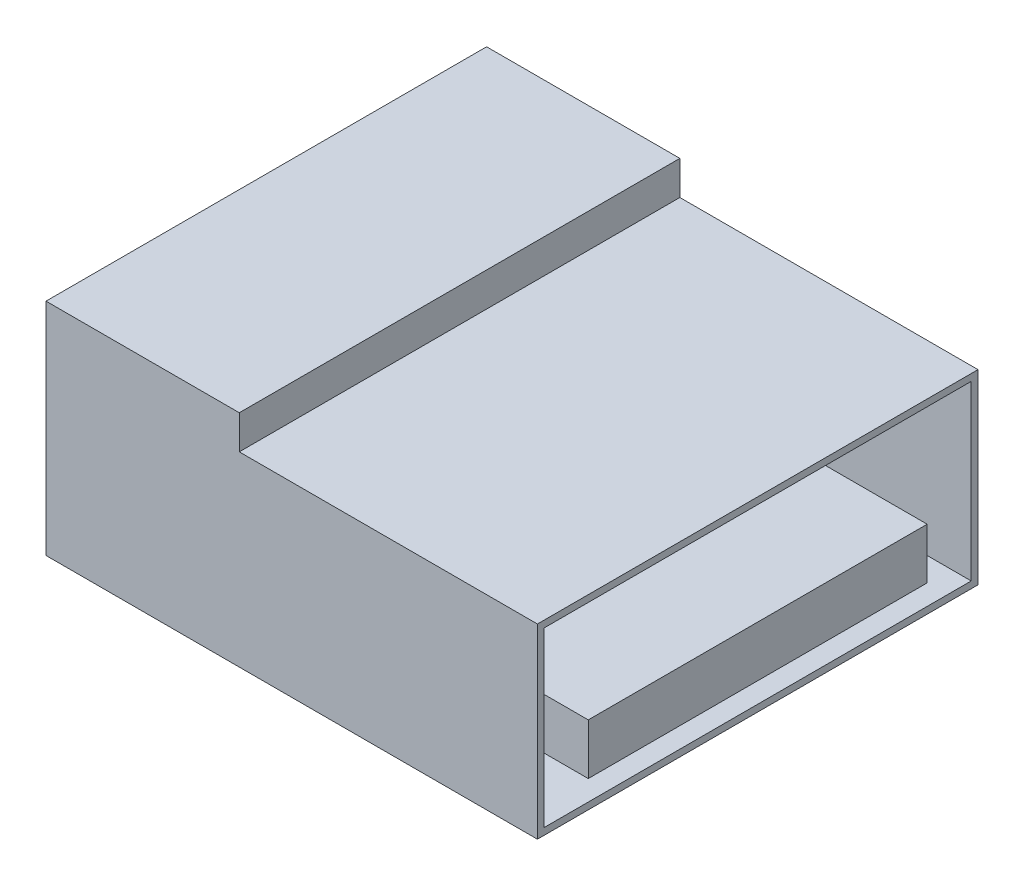
ISO-10303-21;
HEADER;
FILE_DESCRIPTION(('STEP AP214'),'2;1');
FILE_NAME('part.step','',(''),(''),'','','');
FILE_SCHEMA(('AUTOMOTIVE_DESIGN { 1 0 10303 214 1 1 1 1 }'));
ENDSEC;
DATA;
#1=APPLICATION_CONTEXT('core data for automotive mechanical design processes');
#2=APPLICATION_PROTOCOL_DEFINITION('international standard','automotive_design',2000,#1);
#3=PRODUCT_CONTEXT('',#1,'mechanical');
#4=PRODUCT('Part','Part','',(#3));
#5=PRODUCT_RELATED_PRODUCT_CATEGORY('part','',(#4));
#6=PRODUCT_DEFINITION_FORMATION('','',#4);
#7=PRODUCT_DEFINITION_CONTEXT('part definition',#1,'design');
#8=PRODUCT_DEFINITION('design','',#6,#7);
#9=PRODUCT_DEFINITION_SHAPE('','',#8);
#10=(LENGTH_UNIT() NAMED_UNIT(*) SI_UNIT(.MILLI.,.METRE.));
#11=(NAMED_UNIT(*) PLANE_ANGLE_UNIT() SI_UNIT($,.RADIAN.));
#12=(NAMED_UNIT(*) SI_UNIT($,.STERADIAN.) SOLID_ANGLE_UNIT());
#13=UNCERTAINTY_MEASURE_WITH_UNIT(LENGTH_MEASURE(1.E-05),#10,'distance_accuracy_value','');
#14=(GEOMETRIC_REPRESENTATION_CONTEXT(3) GLOBAL_UNCERTAINTY_ASSIGNED_CONTEXT((#13)) GLOBAL_UNIT_ASSIGNED_CONTEXT((#10,
#11,#12)) REPRESENTATION_CONTEXT('',''));
#15=CARTESIAN_POINT('',(0.,0.,0.));
#16=DIRECTION('',(0.,0.,1.));
#17=DIRECTION('',(1.,0.,0.));
#18=AXIS2_PLACEMENT_3D('',#15,#16,#17);
#19=CARTESIAN_POINT('',(-3.58118361153263,0.,0.));
#20=DIRECTION('',(1.,0.,0.));
#21=DIRECTION('',(0.,0.,-1.));
#22=AXIS2_PLACEMENT_3D('',#19,#20,#21);
#23=PLANE('',#22);
#24=DIRECTION('',(0.,-1.,0.));
#25=VECTOR('',#24,1.);
#26=CARTESIAN_POINT('',(-3.58118361153262,5.3,8.31138088012141));
#27=LINE('',#26,#25);
#28=CARTESIAN_POINT('',(-3.58118361153262,5.3,8.31138088012141));
#29=VERTEX_POINT('',#28);
#30=CARTESIAN_POINT('',(-3.58118361153262,0.2,8.31138088012141));
#31=VERTEX_POINT('',#30);
#32=EDGE_CURVE('E177',#29,#31,#27,.T.);
#33=ORIENTED_EDGE('',*,*,#32,.T.);
#34=DIRECTION('',(0.,0.,-1.));
#35=VECTOR('',#34,1.);
#36=CARTESIAN_POINT('',(-3.58118361153262,0.2,8.31138088012141));
#37=LINE('',#36,#35);
#38=CARTESIAN_POINT('',(-3.58118361153263,0.2,-4.2886191198786));
#39=VERTEX_POINT('',#38);
#40=EDGE_CURVE('E181',#31,#39,#37,.T.);
#41=ORIENTED_EDGE('',*,*,#40,.T.);
#42=DIRECTION('',(0.,1.,0.));
#43=VECTOR('',#42,1.);
#44=CARTESIAN_POINT('',(-3.58118361153263,5.3,-4.2886191198786));
#45=LINE('',#44,#43);
#46=CARTESIAN_POINT('',(-3.58118361153263,5.3,-4.2886191198786));
#47=VERTEX_POINT('',#46);
#48=EDGE_CURVE('E186',#39,#47,#45,.T.);
#49=ORIENTED_EDGE('',*,*,#48,.T.);
#50=DIRECTION('',(0.,0.,1.));
#51=VECTOR('',#50,1.);
#52=CARTESIAN_POINT('',(-3.58118361153262,5.3,8.31138088012141));
#53=LINE('',#52,#51);
#54=EDGE_CURVE('E190',#47,#29,#53,.T.);
#55=ORIENTED_EDGE('',*,*,#54,.T.);
#56=EDGE_LOOP('',(#33,#41,#49,#55));
#57=FACE_BOUND('',#56,.T.);
#58=DIRECTION('',(0.,0.,-1.));
#59=VECTOR('',#58,1.);
#60=CARTESIAN_POINT('',(-3.58118361153262,0.799999999999999,7.01138088012141));
#61=LINE('',#60,#59);
#62=CARTESIAN_POINT('',(-3.58118361153262,0.799999999999999,7.01138088012141));
#63=VERTEX_POINT('',#62);
#64=CARTESIAN_POINT('',(-3.58118361153263,0.8,-2.98861911987859));
#65=VERTEX_POINT('',#64);
#66=EDGE_CURVE('E474',#63,#65,#61,.T.);
#67=ORIENTED_EDGE('',*,*,#66,.F.);
#68=DIRECTION('',(0.,-1.,0.));
#69=VECTOR('',#68,1.);
#70=CARTESIAN_POINT('',(-3.58118361153262,2.3,7.01138088012141));
#71=LINE('',#70,#69);
#72=CARTESIAN_POINT('',(-3.58118361153262,2.3,7.01138088012141));
#73=VERTEX_POINT('',#72);
#74=EDGE_CURVE('E166',#73,#63,#71,.T.);
#75=ORIENTED_EDGE('',*,*,#74,.F.);
#76=DIRECTION('',(0.,0.,1.));
#77=VECTOR('',#76,1.);
#78=CARTESIAN_POINT('',(-3.58118361153262,2.3,7.01138088012141));
#79=LINE('',#78,#77);
#80=CARTESIAN_POINT('',(-3.58118361153263,2.3,-2.9886191198786));
#81=VERTEX_POINT('',#80);
#82=EDGE_CURVE('E162',#81,#73,#79,.T.);
#83=ORIENTED_EDGE('',*,*,#82,.F.);
#84=DIRECTION('',(0.,1.,0.));
#85=VECTOR('',#84,1.);
#86=CARTESIAN_POINT('',(-3.58118361153263,2.3,-2.98861911987859));
#87=LINE('',#86,#85);
#88=EDGE_CURVE('E470',#65,#81,#87,.T.);
#89=ORIENTED_EDGE('',*,*,#88,.F.);
#90=EDGE_LOOP('',(#67,#75,#83,#89));
#91=FACE_BOUND('',#90,.T.);
#92=ADVANCED_FACE('F39',(#57,#91),#23,.T.);
#93=CARTESIAN_POINT('',(-8.58118361153263,5.5,-4.48861911987859));
#94=DIRECTION('',(1.,0.,0.));
#95=DIRECTION('',(0.,0.,-1.));
#96=AXIS2_PLACEMENT_3D('',#93,#94,#95);
#97=PLANE('',#96);
#98=DIRECTION('',(0.,0.,1.));
#99=VECTOR('',#98,1.);
#100=CARTESIAN_POINT('',(-8.58118361153263,0.,-4.48861911987859));
#101=LINE('',#100,#99);
#102=CARTESIAN_POINT('',(-8.58118361153263,0.,-4.48861911987859));
#103=VERTEX_POINT('',#102);
#104=CARTESIAN_POINT('',(-8.58118361153263,0.,8.51138088012141));
#105=VERTEX_POINT('',#104);
#106=EDGE_CURVE('E242',#103,#105,#101,.T.);
#107=ORIENTED_EDGE('',*,*,#106,.T.);
#108=DIRECTION('',(0.,-1.,0.));
#109=VECTOR('',#108,1.);
#110=CARTESIAN_POINT('',(-8.58118361153263,5.5,8.51138088012141));
#111=LINE('',#110,#109);
#112=CARTESIAN_POINT('',(-8.58118361153263,6.5,8.51138088012141));
#113=VERTEX_POINT('',#112);
#114=EDGE_CURVE('E11',#113,#105,#111,.T.);
#115=ORIENTED_EDGE('',*,*,#114,.F.);
#116=DIRECTION('',(0.,0.,1.));
#117=VECTOR('',#116,1.);
#118=CARTESIAN_POINT('',(-8.58118361153263,6.5,-4.48861911987859));
#119=LINE('',#118,#117);
#120=CARTESIAN_POINT('',(-8.58118361153263,6.5,-4.48861911987859));
#121=VERTEX_POINT('',#120);
#122=EDGE_CURVE('E217',#121,#113,#119,.T.);
#123=ORIENTED_EDGE('',*,*,#122,.F.);
#124=DIRECTION('',(0.,-1.,0.));
#125=VECTOR('',#124,1.);
#126=CARTESIAN_POINT('',(-8.58118361153263,5.5,-4.48861911987859));
#127=LINE('',#126,#125);
#128=EDGE_CURVE('E253',#121,#103,#127,.T.);
#129=ORIENTED_EDGE('',*,*,#128,.T.);
#130=EDGE_LOOP('',(#107,#115,#123,#129));
#131=FACE_BOUND('',#130,.T.);
#132=ADVANCED_FACE('F41',(#131),#97,.F.);
#133=CARTESIAN_POINT('',(-8.58118361153263,5.5,8.51138088012141));
#134=DIRECTION('',(0.,0.,-1.));
#135=DIRECTION('',(-1.,0.,0.));
#136=AXIS2_PLACEMENT_3D('',#133,#134,#135);
#137=PLANE('',#136);
#138=DIRECTION('',(1.,0.,0.));
#139=VECTOR('',#138,1.);
#140=CARTESIAN_POINT('',(-8.58118361153263,0.,8.51138088012141));
#141=LINE('',#140,#139);
#142=CARTESIAN_POINT('',(5.91881638846738,0.,8.51138088012141));
#143=VERTEX_POINT('',#142);
#144=EDGE_CURVE('E257',#105,#143,#141,.T.);
#145=ORIENTED_EDGE('',*,*,#144,.T.);
#146=DIRECTION('',(0.,-1.,0.));
#147=VECTOR('',#146,1.);
#148=CARTESIAN_POINT('',(5.91881638846738,5.5,8.51138088012141));
#149=LINE('',#148,#147);
#150=CARTESIAN_POINT('',(5.91881638846738,5.5,8.51138088012141));
#151=VERTEX_POINT('',#150);
#152=EDGE_CURVE('E48',#151,#143,#149,.T.);
#153=ORIENTED_EDGE('',*,*,#152,.F.);
#154=DIRECTION('',(1.,0.,0.));
#155=VECTOR('',#154,1.);
#156=CARTESIAN_POINT('',(-8.58118361153263,5.5,8.51138088012141));
#157=LINE('',#156,#155);
#158=CARTESIAN_POINT('',(-2.87803542554563,5.5,8.51138088012141));
#159=VERTEX_POINT('',#158);
#160=EDGE_CURVE('E243',#159,#151,#157,.T.);
#161=ORIENTED_EDGE('',*,*,#160,.F.);
#162=DIRECTION('',(0.,-1.,0.));
#163=VECTOR('',#162,1.);
#164=CARTESIAN_POINT('',(-2.87803542554563,6.5,8.51138088012141));
#165=LINE('',#164,#163);
#166=CARTESIAN_POINT('',(-2.87803542554563,6.5,8.51138088012141));
#167=VERTEX_POINT('',#166);
#168=EDGE_CURVE('E238',#167,#159,#165,.T.);
#169=ORIENTED_EDGE('',*,*,#168,.F.);
#170=DIRECTION('',(1.,0.,0.));
#171=VECTOR('',#170,1.);
#172=CARTESIAN_POINT('',(-8.58118361153263,6.5,8.51138088012141));
#173=LINE('',#172,#171);
#174=EDGE_CURVE('E221',#113,#167,#173,.T.);
#175=ORIENTED_EDGE('',*,*,#174,.F.);
#176=ORIENTED_EDGE('',*,*,#114,.T.);
#177=EDGE_LOOP('',(#145,#153,#161,#169,#175,#176));
#178=FACE_BOUND('',#177,.T.);
#179=ADVANCED_FACE('F301',(#178),#137,.F.);
#180=CARTESIAN_POINT('',(5.91881638846737,5.5,-4.48861911987859));
#181=DIRECTION('',(-1.,0.,0.));
#182=DIRECTION('',(0.,0.,1.));
#183=AXIS2_PLACEMENT_3D('',#180,#181,#182);
#184=PLANE('',#183);
#185=DIRECTION('',(0.,0.,-1.));
#186=VECTOR('',#185,1.);
#187=CARTESIAN_POINT('',(5.91881638846738,0.2,8.3113808801214));
#188=LINE('',#187,#186);
#189=CARTESIAN_POINT('',(5.91881638846738,0.2,8.31138088012141));
#190=VERTEX_POINT('',#189);
#191=CARTESIAN_POINT('',(5.91881638846737,0.2,-4.2886191198786));
#192=VERTEX_POINT('',#191);
#193=EDGE_CURVE('E172',#190,#192,#188,.T.);
#194=ORIENTED_EDGE('',*,*,#193,.F.);
#195=DIRECTION('',(0.,-1.,0.));
#196=VECTOR('',#195,1.);
#197=CARTESIAN_POINT('',(5.91881638846738,5.3,8.3113808801214));
#198=LINE('',#197,#196);
#199=CARTESIAN_POINT('',(5.91881638846738,5.3,8.3113808801214));
#200=VERTEX_POINT('',#199);
#201=EDGE_CURVE('E63',#200,#190,#198,.T.);
#202=ORIENTED_EDGE('',*,*,#201,.F.);
#203=DIRECTION('',(0.,0.,1.));
#204=VECTOR('',#203,1.);
#205=CARTESIAN_POINT('',(5.91881638846738,5.3,8.3113808801214));
#206=LINE('',#205,#204);
#207=CARTESIAN_POINT('',(5.91881638846737,5.3,-4.2886191198786));
#208=VERTEX_POINT('',#207);
#209=EDGE_CURVE('E182',#208,#200,#206,.T.);
#210=ORIENTED_EDGE('',*,*,#209,.F.);
#211=DIRECTION('',(0.,1.,0.));
#212=VECTOR('',#211,1.);
#213=CARTESIAN_POINT('',(5.91881638846737,5.3,-4.2886191198786));
#214=LINE('',#213,#212);
#215=EDGE_CURVE('E198',#192,#208,#214,.T.);
#216=ORIENTED_EDGE('',*,*,#215,.F.);
#217=EDGE_LOOP('',(#194,#202,#210,#216));
#218=FACE_BOUND('',#217,.T.);
#219=DIRECTION('',(0.,0.,-1.));
#220=VECTOR('',#219,1.);
#221=CARTESIAN_POINT('',(5.91881638846737,0.,-4.48861911987859));
#222=LINE('',#221,#220);
#223=CARTESIAN_POINT('',(5.91881638846737,0.,-4.48861911987859));
#224=VERTEX_POINT('',#223);
#225=EDGE_CURVE('E260',#143,#224,#222,.T.);
#226=ORIENTED_EDGE('',*,*,#225,.T.);
#227=DIRECTION('',(0.,-1.,0.));
#228=VECTOR('',#227,1.);
#229=CARTESIAN_POINT('',(5.91881638846737,5.5,-4.48861911987859));
#230=LINE('',#229,#228);
#231=CARTESIAN_POINT('',(5.91881638846737,5.5,-4.48861911987859));
#232=VERTEX_POINT('',#231);
#233=EDGE_CURVE('E268',#232,#224,#230,.T.);
#234=ORIENTED_EDGE('',*,*,#233,.F.);
#235=DIRECTION('',(0.,0.,-1.));
#236=VECTOR('',#235,1.);
#237=CARTESIAN_POINT('',(5.91881638846737,5.5,-4.48861911987859));
#238=LINE('',#237,#236);
#239=EDGE_CURVE('E246',#151,#232,#238,.T.);
#240=ORIENTED_EDGE('',*,*,#239,.F.);
#241=ORIENTED_EDGE('',*,*,#152,.T.);
#242=EDGE_LOOP('',(#226,#234,#240,#241));
#243=FACE_BOUND('',#242,.T.);
#244=ADVANCED_FACE('F277',(#218,#243),#184,.F.);
#245=CARTESIAN_POINT('',(-8.58118361153263,5.5,-4.48861911987859));
#246=DIRECTION('',(0.,0.,1.));
#247=DIRECTION('',(1.,0.,0.));
#248=AXIS2_PLACEMENT_3D('',#245,#246,#247);
#249=PLANE('',#248);
#250=DIRECTION('',(-1.,0.,0.));
#251=VECTOR('',#250,1.);
#252=CARTESIAN_POINT('',(-8.58118361153263,0.,-4.48861911987859));
#253=LINE('',#252,#251);
#254=EDGE_CURVE('E247',#224,#103,#253,.T.);
#255=ORIENTED_EDGE('',*,*,#254,.T.);
#256=ORIENTED_EDGE('',*,*,#128,.F.);
#257=DIRECTION('',(-1.,0.,0.));
#258=VECTOR('',#257,1.);
#259=CARTESIAN_POINT('',(-8.58118361153263,6.5,-4.48861911987859));
#260=LINE('',#259,#258);
#261=CARTESIAN_POINT('',(-2.87803542554563,6.5,-4.48861911987859));
#262=VERTEX_POINT('',#261);
#263=EDGE_CURVE('E227',#262,#121,#260,.T.);
#264=ORIENTED_EDGE('',*,*,#263,.F.);
#265=DIRECTION('',(0.,-1.,0.));
#266=VECTOR('',#265,1.);
#267=CARTESIAN_POINT('',(-2.87803542554563,6.5,-4.48861911987859));
#268=LINE('',#267,#266);
#269=CARTESIAN_POINT('',(-2.87803542554563,5.5,-4.48861911987859));
#270=VERTEX_POINT('',#269);
#271=EDGE_CURVE('E231',#262,#270,#268,.T.);
#272=ORIENTED_EDGE('',*,*,#271,.T.);
#273=DIRECTION('',(-1.,0.,0.));
#274=VECTOR('',#273,1.);
#275=CARTESIAN_POINT('',(-8.58118361153263,5.5,-4.48861911987859));
#276=LINE('',#275,#274);
#277=EDGE_CURVE('E250',#232,#270,#276,.T.);
#278=ORIENTED_EDGE('',*,*,#277,.F.);
#279=ORIENTED_EDGE('',*,*,#233,.T.);
#280=EDGE_LOOP('',(#255,#256,#264,#272,#278,#279));
#281=FACE_BOUND('',#280,.T.);
#282=ADVANCED_FACE('F286',(#281),#249,.F.);
#283=CARTESIAN_POINT('',(0.,5.5,0.));
#284=DIRECTION('',(0.,1.,0.));
#285=DIRECTION('',(0.,0.,1.));
#286=AXIS2_PLACEMENT_3D('',#283,#284,#285);
#287=PLANE('',#286);
#288=DIRECTION('',(0.,0.,-1.));
#289=VECTOR('',#288,1.);
#290=CARTESIAN_POINT('',(-2.87803542554563,5.5,-4.48861911987859));
#291=LINE('',#290,#289);
#292=EDGE_CURVE('E208',#159,#270,#291,.T.);
#293=ORIENTED_EDGE('',*,*,#292,.F.);
#294=ORIENTED_EDGE('',*,*,#160,.T.);
#295=ORIENTED_EDGE('',*,*,#239,.T.);
#296=ORIENTED_EDGE('',*,*,#277,.T.);
#297=EDGE_LOOP('',(#293,#294,#295,#296));
#298=FACE_BOUND('',#297,.T.);
#299=ADVANCED_FACE('F300',(#298),#287,.T.);
#300=CARTESIAN_POINT('',(0.,0.,0.));
#301=DIRECTION('',(0.,1.,0.));
#302=DIRECTION('',(0.,0.,1.));
#303=AXIS2_PLACEMENT_3D('',#300,#301,#302);
#304=PLANE('',#303);
#305=ORIENTED_EDGE('',*,*,#106,.F.);
#306=ORIENTED_EDGE('',*,*,#254,.F.);
#307=ORIENTED_EDGE('',*,*,#225,.F.);
#308=ORIENTED_EDGE('',*,*,#144,.F.);
#309=EDGE_LOOP('',(#305,#306,#307,#308));
#310=FACE_BOUND('',#309,.T.);
#311=ADVANCED_FACE('F284',(#310),#304,.F.);
#312=CARTESIAN_POINT('',(-2.87803542554563,6.5,-4.48861911987859));
#313=DIRECTION('',(-1.,0.,0.));
#314=DIRECTION('',(0.,0.,1.));
#315=AXIS2_PLACEMENT_3D('',#312,#313,#314);
#316=PLANE('',#315);
#317=ORIENTED_EDGE('',*,*,#292,.T.);
#318=ORIENTED_EDGE('',*,*,#271,.F.);
#319=DIRECTION('',(0.,0.,-1.));
#320=VECTOR('',#319,1.);
#321=CARTESIAN_POINT('',(-2.87803542554563,6.5,-4.48861911987859));
#322=LINE('',#321,#320);
#323=EDGE_CURVE('E224',#167,#262,#322,.T.);
#324=ORIENTED_EDGE('',*,*,#323,.F.);
#325=ORIENTED_EDGE('',*,*,#168,.T.);
#326=EDGE_LOOP('',(#317,#318,#324,#325));
#327=FACE_BOUND('',#326,.T.);
#328=ADVANCED_FACE('F298',(#327),#316,.F.);
#329=CARTESIAN_POINT('',(0.,6.5,0.));
#330=DIRECTION('',(0.,1.,0.));
#331=DIRECTION('',(0.,0.,1.));
#332=AXIS2_PLACEMENT_3D('',#329,#330,#331);
#333=PLANE('',#332);
#334=ORIENTED_EDGE('',*,*,#122,.T.);
#335=ORIENTED_EDGE('',*,*,#174,.T.);
#336=ORIENTED_EDGE('',*,*,#323,.T.);
#337=ORIENTED_EDGE('',*,*,#263,.T.);
#338=EDGE_LOOP('',(#334,#335,#336,#337));
#339=FACE_BOUND('',#338,.T.);
#340=ADVANCED_FACE('F293',(#339),#333,.T.);
#341=CARTESIAN_POINT('',(-3.58118361153262,5.3,8.31138088012141));
#342=DIRECTION('',(0.,0.,1.));
#343=DIRECTION('',(1.,0.,0.));
#344=AXIS2_PLACEMENT_3D('',#341,#342,#343);
#345=PLANE('',#344);
#346=ORIENTED_EDGE('',*,*,#201,.T.);
#347=DIRECTION('',(1.,0.,0.));
#348=VECTOR('',#347,1.);
#349=CARTESIAN_POINT('',(-3.58118361153262,0.2,8.31138088012141));
#350=LINE('',#349,#348);
#351=EDGE_CURVE('E193',#31,#190,#350,.T.);
#352=ORIENTED_EDGE('',*,*,#351,.F.);
#353=ORIENTED_EDGE('',*,*,#32,.F.);
#354=DIRECTION('',(1.,0.,0.));
#355=VECTOR('',#354,1.);
#356=CARTESIAN_POINT('',(-3.58118361153262,5.3,8.31138088012141));
#357=LINE('',#356,#355);
#358=EDGE_CURVE('E205',#29,#200,#357,.T.);
#359=ORIENTED_EDGE('',*,*,#358,.T.);
#360=EDGE_LOOP('',(#346,#352,#353,#359));
#361=FACE_BOUND('',#360,.T.);
#362=ADVANCED_FACE('F322',(#361),#345,.F.);
#363=CARTESIAN_POINT('',(-3.58118361153262,5.3,8.31138088012141));
#364=DIRECTION('',(0.,1.,0.));
#365=DIRECTION('',(0.,0.,1.));
#366=AXIS2_PLACEMENT_3D('',#363,#364,#365);
#367=PLANE('',#366);
#368=ORIENTED_EDGE('',*,*,#209,.T.);
#369=ORIENTED_EDGE('',*,*,#358,.F.);
#370=ORIENTED_EDGE('',*,*,#54,.F.);
#371=DIRECTION('',(1.,0.,0.));
#372=VECTOR('',#371,1.);
#373=CARTESIAN_POINT('',(-3.58118361153263,5.3,-4.2886191198786));
#374=LINE('',#373,#372);
#375=EDGE_CURVE('E209',#47,#208,#374,.T.);
#376=ORIENTED_EDGE('',*,*,#375,.T.);
#377=EDGE_LOOP('',(#368,#369,#370,#376));
#378=FACE_BOUND('',#377,.T.);
#379=ADVANCED_FACE('F318',(#378),#367,.F.);
#380=CARTESIAN_POINT('',(-3.58118361153263,5.3,-4.2886191198786));
#381=DIRECTION('',(0.,0.,-1.));
#382=DIRECTION('',(-1.,0.,0.));
#383=AXIS2_PLACEMENT_3D('',#380,#381,#382);
#384=PLANE('',#383);
#385=ORIENTED_EDGE('',*,*,#215,.T.);
#386=ORIENTED_EDGE('',*,*,#375,.F.);
#387=ORIENTED_EDGE('',*,*,#48,.F.);
#388=DIRECTION('',(1.,0.,0.));
#389=VECTOR('',#388,1.);
#390=CARTESIAN_POINT('',(-3.58118361153263,0.2,-4.2886191198786));
#391=LINE('',#390,#389);
#392=EDGE_CURVE('E212',#39,#192,#391,.T.);
#393=ORIENTED_EDGE('',*,*,#392,.T.);
#394=EDGE_LOOP('',(#385,#386,#387,#393));
#395=FACE_BOUND('',#394,.T.);
#396=ADVANCED_FACE('F321',(#395),#384,.F.);
#397=CARTESIAN_POINT('',(-3.58118361153262,0.2,8.31138088012141));
#398=DIRECTION('',(0.,-1.,0.));
#399=DIRECTION('',(0.,0.,-1.));
#400=AXIS2_PLACEMENT_3D('',#397,#398,#399);
#401=PLANE('',#400);
#402=ORIENTED_EDGE('',*,*,#193,.T.);
#403=ORIENTED_EDGE('',*,*,#392,.F.);
#404=ORIENTED_EDGE('',*,*,#40,.F.);
#405=ORIENTED_EDGE('',*,*,#351,.T.);
#406=EDGE_LOOP('',(#402,#403,#404,#405));
#407=FACE_BOUND('',#406,.T.);
#408=ADVANCED_FACE('F326',(#407),#401,.F.);
#409=CARTESIAN_POINT('',(5.91881638846738,2.3,7.01138088012141));
#410=DIRECTION('',(0.,0.,-1.));
#411=DIRECTION('',(-1.,0.,0.));
#412=AXIS2_PLACEMENT_3D('',#409,#410,#411);
#413=PLANE('',#412);
#414=ORIENTED_EDGE('',*,*,#74,.T.);
#415=DIRECTION('',(-1.,0.,0.));
#416=VECTOR('',#415,1.);
#417=CARTESIAN_POINT('',(5.91881638846738,0.799999999999999,7.01138088012141));
#418=LINE('',#417,#416);
#419=CARTESIAN_POINT('',(5.91881638846738,0.799999999999999,7.01138088012141));
#420=VERTEX_POINT('',#419);
#421=EDGE_CURVE('E145',#420,#63,#418,.T.);
#422=ORIENTED_EDGE('',*,*,#421,.F.);
#423=DIRECTION('',(0.,-1.,0.));
#424=VECTOR('',#423,1.);
#425=CARTESIAN_POINT('',(5.91881638846738,2.3,7.01138088012141));
#426=LINE('',#425,#424);
#427=CARTESIAN_POINT('',(5.91881638846738,2.3,7.01138088012141));
#428=VERTEX_POINT('',#427);
#429=EDGE_CURVE('E153',#428,#420,#426,.T.);
#430=ORIENTED_EDGE('',*,*,#429,.F.);
#431=DIRECTION('',(-1.,0.,0.));
#432=VECTOR('',#431,1.);
#433=CARTESIAN_POINT('',(5.91881638846738,2.3,7.01138088012141));
#434=LINE('',#433,#432);
#435=EDGE_CURVE('E467',#428,#73,#434,.T.);
#436=ORIENTED_EDGE('',*,*,#435,.T.);
#437=EDGE_LOOP('',(#414,#422,#430,#436));
#438=FACE_BOUND('',#437,.T.);
#439=ADVANCED_FACE('F164',(#438),#413,.F.);
#440=CARTESIAN_POINT('',(5.91881638846738,0.799999999999999,7.01138088012141));
#441=DIRECTION('',(0.,1.,0.));
#442=DIRECTION('',(0.,0.,1.));
#443=AXIS2_PLACEMENT_3D('',#440,#441,#442);
#444=PLANE('',#443);
#445=ORIENTED_EDGE('',*,*,#66,.T.);
#446=DIRECTION('',(-1.,0.,0.));
#447=VECTOR('',#446,1.);
#448=CARTESIAN_POINT('',(5.91881638846737,0.8,-2.9886191198786));
#449=LINE('',#448,#447);
#450=CARTESIAN_POINT('',(5.91881638846737,0.8,-2.9886191198786));
#451=VERTEX_POINT('',#450);
#452=EDGE_CURVE('E148',#451,#65,#449,.T.);
#453=ORIENTED_EDGE('',*,*,#452,.F.);
#454=DIRECTION('',(0.,0.,-1.));
#455=VECTOR('',#454,1.);
#456=CARTESIAN_POINT('',(5.91881638846738,0.799999999999999,7.01138088012141));
#457=LINE('',#456,#455);
#458=EDGE_CURVE('E141',#420,#451,#457,.T.);
#459=ORIENTED_EDGE('',*,*,#458,.F.);
#460=ORIENTED_EDGE('',*,*,#421,.T.);
#461=EDGE_LOOP('',(#445,#453,#459,#460));
#462=FACE_BOUND('',#461,.T.);
#463=ADVANCED_FACE('F143',(#462),#444,.F.);
#464=CARTESIAN_POINT('',(5.91881638846737,2.3,-2.9886191198786));
#465=DIRECTION('',(0.,0.,1.));
#466=DIRECTION('',(0.,-1.,0.));
#467=AXIS2_PLACEMENT_3D('',#464,#465,#466);
#468=PLANE('',#467);
#469=ORIENTED_EDGE('',*,*,#88,.T.);
#470=DIRECTION('',(-1.,0.,0.));
#471=VECTOR('',#470,1.);
#472=CARTESIAN_POINT('',(5.91881638846737,2.3,-2.9886191198786));
#473=LINE('',#472,#471);
#474=CARTESIAN_POINT('',(5.91881638846737,2.3,-2.9886191198786));
#475=VERTEX_POINT('',#474);
#476=EDGE_CURVE('E55',#475,#81,#473,.T.);
#477=ORIENTED_EDGE('',*,*,#476,.F.);
#478=DIRECTION('',(0.,1.,0.));
#479=VECTOR('',#478,1.);
#480=CARTESIAN_POINT('',(5.91881638846737,2.3,-2.9886191198786));
#481=LINE('',#480,#479);
#482=EDGE_CURVE('E152',#451,#475,#481,.T.);
#483=ORIENTED_EDGE('',*,*,#482,.F.);
#484=ORIENTED_EDGE('',*,*,#452,.T.);
#485=EDGE_LOOP('',(#469,#477,#483,#484));
#486=FACE_BOUND('',#485,.T.);
#487=ADVANCED_FACE('F390',(#486),#468,.F.);
#488=CARTESIAN_POINT('',(5.91881638846738,2.3,7.01138088012141));
#489=DIRECTION('',(0.,-1.,0.));
#490=DIRECTION('',(0.,0.,-1.));
#491=AXIS2_PLACEMENT_3D('',#488,#489,#490);
#492=PLANE('',#491);
#493=ORIENTED_EDGE('',*,*,#82,.T.);
#494=ORIENTED_EDGE('',*,*,#435,.F.);
#495=DIRECTION('',(0.,0.,1.));
#496=VECTOR('',#495,1.);
#497=CARTESIAN_POINT('',(5.91881638846738,2.3,7.01138088012141));
#498=LINE('',#497,#496);
#499=EDGE_CURVE('E157',#475,#428,#498,.T.);
#500=ORIENTED_EDGE('',*,*,#499,.F.);
#501=ORIENTED_EDGE('',*,*,#476,.T.);
#502=EDGE_LOOP('',(#493,#494,#500,#501));
#503=FACE_BOUND('',#502,.T.);
#504=ADVANCED_FACE('F396',(#503),#492,.F.);
#505=CARTESIAN_POINT('',(5.91881638846737,0.,0.));
#506=DIRECTION('',(1.,0.,0.));
#507=DIRECTION('',(0.,0.,-1.));
#508=AXIS2_PLACEMENT_3D('',#505,#506,#507);
#509=PLANE('',#508);
#510=ORIENTED_EDGE('',*,*,#429,.T.);
#511=ORIENTED_EDGE('',*,*,#458,.T.);
#512=ORIENTED_EDGE('',*,*,#482,.T.);
#513=ORIENTED_EDGE('',*,*,#499,.T.);
#514=EDGE_LOOP('',(#510,#511,#512,#513));
#515=FACE_BOUND('',#514,.T.);
#516=ADVANCED_FACE('F156',(#515),#509,.T.);
#517=CLOSED_SHELL('',(#92,#132,#179,#244,#282,#299,#311,#328,#340,#362,#379,#396,#408,#439,#463,
#487,#504,#516));
#518=MANIFOLD_SOLID_BREP('B2',#517);
#519=ADVANCED_BREP_SHAPE_REPRESENTATION('',(#18,#518),#14);
#520=SHAPE_DEFINITION_REPRESENTATION(#9,#519);
ENDSEC;
END-ISO-10303-21;
